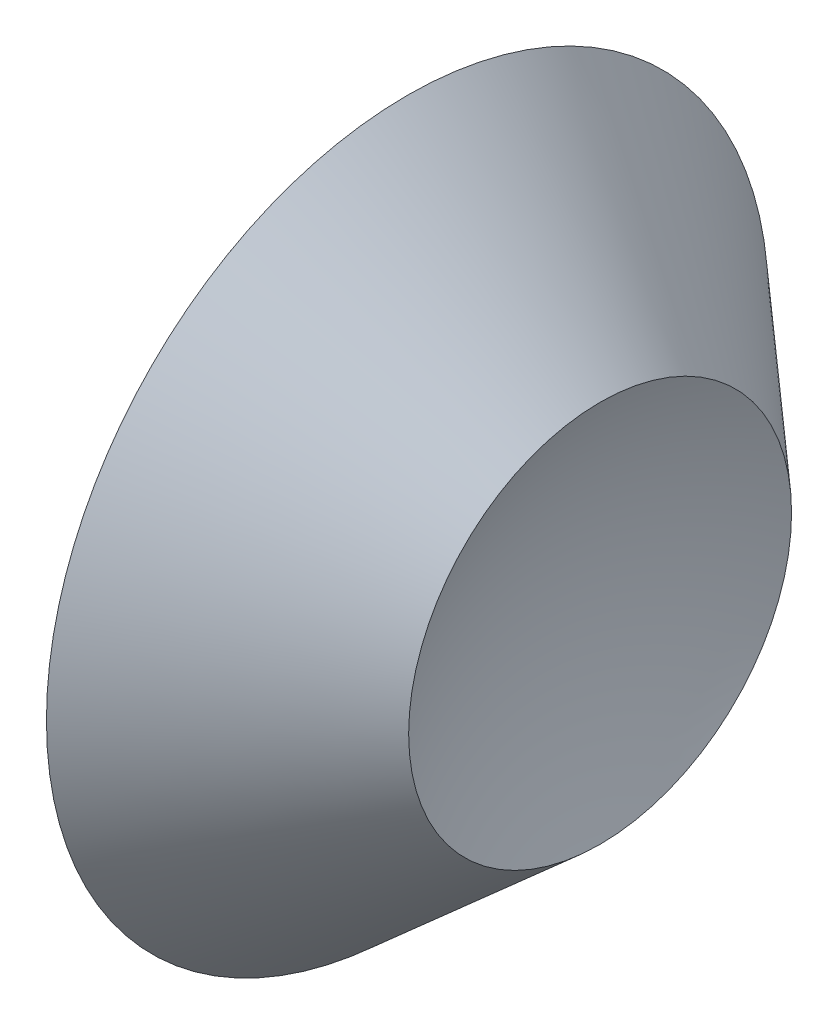
ISO-10303-21;
HEADER;
FILE_DESCRIPTION(('STEP AP214'),'2;1');
FILE_NAME('part.step','',(''),(''),'','','');
FILE_SCHEMA(('AUTOMOTIVE_DESIGN { 1 0 10303 214 1 1 1 1 }'));
ENDSEC;
DATA;
#1=APPLICATION_CONTEXT('core data for automotive mechanical design processes');
#2=APPLICATION_PROTOCOL_DEFINITION('international standard','automotive_design',2000,#1);
#3=PRODUCT_CONTEXT('',#1,'mechanical');
#4=PRODUCT('Part','Part','',(#3));
#5=PRODUCT_RELATED_PRODUCT_CATEGORY('part','',(#4));
#6=PRODUCT_DEFINITION_FORMATION('','',#4);
#7=PRODUCT_DEFINITION_CONTEXT('part definition',#1,'design');
#8=PRODUCT_DEFINITION('design','',#6,#7);
#9=PRODUCT_DEFINITION_SHAPE('','',#8);
#10=(LENGTH_UNIT() NAMED_UNIT(*) SI_UNIT(.MILLI.,.METRE.));
#11=(NAMED_UNIT(*) PLANE_ANGLE_UNIT() SI_UNIT($,.RADIAN.));
#12=(NAMED_UNIT(*) SI_UNIT($,.STERADIAN.) SOLID_ANGLE_UNIT());
#13=UNCERTAINTY_MEASURE_WITH_UNIT(LENGTH_MEASURE(1.E-05),#10,'distance_accuracy_value','');
#14=(GEOMETRIC_REPRESENTATION_CONTEXT(3) GLOBAL_UNCERTAINTY_ASSIGNED_CONTEXT((#13)) GLOBAL_UNIT_ASSIGNED_CONTEXT((#10,
#11,#12)) REPRESENTATION_CONTEXT('',''));
#15=CARTESIAN_POINT('',(0.,0.,0.));
#16=DIRECTION('',(0.,0.,1.));
#17=DIRECTION('',(1.,0.,0.));
#18=AXIS2_PLACEMENT_3D('',#15,#16,#17);
#19=CARTESIAN_POINT('',(-48.4079491791598,0.,0.));
#20=DIRECTION('',(-1.,0.,0.));
#21=DIRECTION('',(0.,-1.,0.));
#22=AXIS2_PLACEMENT_3D('',#19,#20,#21);
#23=SPHERICAL_SURFACE('',#22,4.95961072513992);
#24=CARTESIAN_POINT('',(-52.9992417827652,0.,0.));
#25=DIRECTION('',(-1.,0.,0.));
#26=DIRECTION('',(0.,0.,1.));
#27=AXIS2_PLACEMENT_3D('',#24,#25,#26);
#28=CIRCLE('',#27,1.87557211884837);
#29=CARTESIAN_POINT('',(-52.9992417827652,0.,1.87557211884837));
#30=VERTEX_POINT('',#29);
#31=EDGE_CURVE('E12',#30,#30,#28,.T.);
#32=ORIENTED_EDGE('',*,*,#31,.F.);
#33=EDGE_LOOP('',(#32));
#34=FACE_BOUND('',#33,.T.);
#35=ADVANCED_FACE('F42',(#34),#23,.F.);
#36=CARTESIAN_POINT('',(-52.9992417827652,0.,0.));
#37=DIRECTION('',(-1.,0.,0.));
#38=DIRECTION('',(0.,0.,1.));
#39=AXIS2_PLACEMENT_3D('',#36,#37,#38);
#40=CONICAL_SURFACE('',#39,1.87557211884837,0.721905944370535);
#41=CARTESIAN_POINT('',(-54.8861580304403,0.,0.));
#42=DIRECTION('',(-1.,0.,0.));
#43=DIRECTION('',(0.,0.,1.));
#44=AXIS2_PLACEMENT_3D('',#41,#42,#43);
#45=CIRCLE('',#44,3.53689929988604);
#46=CARTESIAN_POINT('',(-54.8861580304403,0.,3.53689929988604));
#47=VERTEX_POINT('',#46);
#48=EDGE_CURVE('E48',#47,#47,#45,.T.);
#49=ORIENTED_EDGE('',*,*,#48,.F.);
#50=EDGE_LOOP('',(#49));
#51=FACE_BOUND('',#50,.T.);
#52=ORIENTED_EDGE('',*,*,#31,.T.);
#53=EDGE_LOOP('',(#52));
#54=FACE_BOUND('',#53,.T.);
#55=ADVANCED_FACE('F56',(#51,#54),#40,.T.);
#56=CARTESIAN_POINT('',(0.,0.,0.));
#57=DIRECTION('',(-1.,0.,0.));
#58=DIRECTION('',(0.,1.,0.));
#59=AXIS2_PLACEMENT_3D('',#56,#57,#58);
#60=SPHERICAL_SURFACE('',#59,55.);
#61=ORIENTED_EDGE('',*,*,#48,.T.);
#62=EDGE_LOOP('',(#61));
#63=FACE_BOUND('',#62,.T.);
#64=ADVANCED_FACE('F54',(#63),#60,.T.);
#65=CLOSED_SHELL('',(#35,#55,#64));
#66=MANIFOLD_SOLID_BREP('B2',#65);
#67=ADVANCED_BREP_SHAPE_REPRESENTATION('',(#18,#66),#14);
#68=SHAPE_DEFINITION_REPRESENTATION(#9,#67);
ENDSEC;
END-ISO-10303-21;
